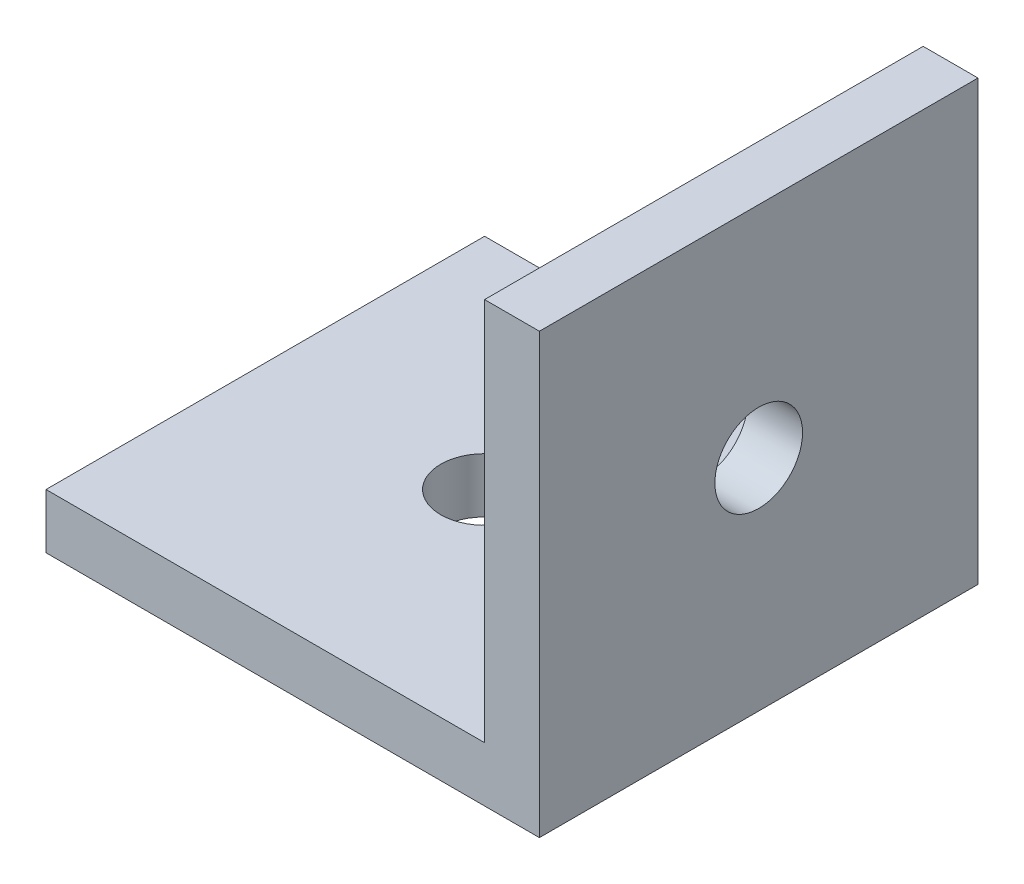
ISO-10303-21;
HEADER;
FILE_DESCRIPTION(('STEP AP214'),'2;1');
FILE_NAME('part.step','',(''),(''),'','','');
FILE_SCHEMA(('AUTOMOTIVE_DESIGN { 1 0 10303 214 1 1 1 1 }'));
ENDSEC;
DATA;
#1=APPLICATION_CONTEXT('core data for automotive mechanical design processes');
#2=APPLICATION_PROTOCOL_DEFINITION('international standard','automotive_design',2000,#1);
#3=PRODUCT_CONTEXT('',#1,'mechanical');
#4=PRODUCT('Part','Part','',(#3));
#5=PRODUCT_RELATED_PRODUCT_CATEGORY('part','',(#4));
#6=PRODUCT_DEFINITION_FORMATION('','',#4);
#7=PRODUCT_DEFINITION_CONTEXT('part definition',#1,'design');
#8=PRODUCT_DEFINITION('design','',#6,#7);
#9=PRODUCT_DEFINITION_SHAPE('','',#8);
#10=(LENGTH_UNIT() NAMED_UNIT(*) SI_UNIT(.MILLI.,.METRE.));
#11=(NAMED_UNIT(*) PLANE_ANGLE_UNIT() SI_UNIT($,.RADIAN.));
#12=(NAMED_UNIT(*) SI_UNIT($,.STERADIAN.) SOLID_ANGLE_UNIT());
#13=UNCERTAINTY_MEASURE_WITH_UNIT(LENGTH_MEASURE(1.E-05),#10,'distance_accuracy_value','');
#14=(GEOMETRIC_REPRESENTATION_CONTEXT(3) GLOBAL_UNCERTAINTY_ASSIGNED_CONTEXT((#13)) GLOBAL_UNIT_ASSIGNED_CONTEXT((#10,
#11,#12)) REPRESENTATION_CONTEXT('',''));
#15=CARTESIAN_POINT('',(0.,0.,0.));
#16=DIRECTION('',(0.,0.,1.));
#17=DIRECTION('',(1.,0.,0.));
#18=AXIS2_PLACEMENT_3D('',#15,#16,#17);
#19=CARTESIAN_POINT('',(0.,5.,0.));
#20=DIRECTION('',(0.,1.,0.));
#21=DIRECTION('',(0.,0.,1.));
#22=AXIS2_PLACEMENT_3D('',#19,#20,#21);
#23=PLANE('',#22);
#24=DIRECTION('',(0.,0.,1.));
#25=VECTOR('',#24,1.);
#26=CARTESIAN_POINT('',(-20.,5.,20.));
#27=LINE('',#26,#25);
#28=CARTESIAN_POINT('',(-20.,5.,-20.));
#29=VERTEX_POINT('',#28);
#30=CARTESIAN_POINT('',(-20.,5.,20.));
#31=VERTEX_POINT('',#30);
#32=EDGE_CURVE('E102',#29,#31,#27,.T.);
#33=ORIENTED_EDGE('',*,*,#32,.T.);
#34=DIRECTION('',(1.,0.,0.));
#35=VECTOR('',#34,1.);
#36=CARTESIAN_POINT('',(20.,5.,20.));
#37=LINE('',#36,#35);
#38=CARTESIAN_POINT('',(20.,5.,20.));
#39=VERTEX_POINT('',#38);
#40=EDGE_CURVE('E96',#31,#39,#37,.T.);
#41=ORIENTED_EDGE('',*,*,#40,.T.);
#42=DIRECTION('',(0.,0.,-1.));
#43=VECTOR('',#42,1.);
#44=CARTESIAN_POINT('',(20.,5.,20.));
#45=LINE('',#44,#43);
#46=CARTESIAN_POINT('',(20.,5.,-20.));
#47=VERTEX_POINT('',#46);
#48=EDGE_CURVE('E85',#39,#47,#45,.T.);
#49=ORIENTED_EDGE('',*,*,#48,.T.);
#50=DIRECTION('',(-1.,0.,0.));
#51=VECTOR('',#50,1.);
#52=CARTESIAN_POINT('',(20.,5.,-20.));
#53=LINE('',#52,#51);
#54=EDGE_CURVE('E65',#47,#29,#53,.T.);
#55=ORIENTED_EDGE('',*,*,#54,.T.);
#56=EDGE_LOOP('',(#33,#41,#49,#55));
#57=FACE_BOUND('',#56,.T.);
#58=CARTESIAN_POINT('',(0.,5.,0.));
#59=DIRECTION('',(0.,1.,0.));
#60=DIRECTION('',(0.,0.,1.));
#61=AXIS2_PLACEMENT_3D('',#58,#59,#60);
#62=CIRCLE('',#61,4.);
#63=CARTESIAN_POINT('',(0.,5.,4.));
#64=VERTEX_POINT('',#63);
#65=EDGE_CURVE('E112',#64,#64,#62,.T.);
#66=ORIENTED_EDGE('',*,*,#65,.F.);
#67=EDGE_LOOP('',(#66));
#68=FACE_BOUND('',#67,.T.);
#69=ADVANCED_FACE('F48',(#57,#68),#23,.T.);
#70=CARTESIAN_POINT('',(0.,0.,0.));
#71=DIRECTION('',(0.,1.,0.));
#72=DIRECTION('',(0.,0.,1.));
#73=AXIS2_PLACEMENT_3D('',#70,#71,#72);
#74=PLANE('',#73);
#75=DIRECTION('',(0.,0.,1.));
#76=VECTOR('',#75,1.);
#77=CARTESIAN_POINT('',(-20.,0.,20.));
#78=LINE('',#77,#76);
#79=CARTESIAN_POINT('',(-20.,0.,-20.));
#80=VERTEX_POINT('',#79);
#81=CARTESIAN_POINT('',(-20.,0.,20.));
#82=VERTEX_POINT('',#81);
#83=EDGE_CURVE('E110',#80,#82,#78,.T.);
#84=ORIENTED_EDGE('',*,*,#83,.F.);
#85=DIRECTION('',(-1.,0.,0.));
#86=VECTOR('',#85,1.);
#87=CARTESIAN_POINT('',(20.,0.,-20.));
#88=LINE('',#87,#86);
#89=CARTESIAN_POINT('',(25.,0.,-20.));
#90=VERTEX_POINT('',#89);
#91=EDGE_CURVE('E108',#90,#80,#88,.T.);
#92=ORIENTED_EDGE('',*,*,#91,.F.);
#93=DIRECTION('',(0.,0.,-1.));
#94=VECTOR('',#93,1.);
#95=CARTESIAN_POINT('',(25.,0.,20.));
#96=LINE('',#95,#94);
#97=CARTESIAN_POINT('',(25.,0.,20.));
#98=VERTEX_POINT('',#97);
#99=EDGE_CURVE('E141',#98,#90,#96,.T.);
#100=ORIENTED_EDGE('',*,*,#99,.F.);
#101=DIRECTION('',(1.,0.,0.));
#102=VECTOR('',#101,1.);
#103=CARTESIAN_POINT('',(20.,0.,20.));
#104=LINE('',#103,#102);
#105=EDGE_CURVE('E78',#82,#98,#104,.T.);
#106=ORIENTED_EDGE('',*,*,#105,.F.);
#107=EDGE_LOOP('',(#84,#92,#100,#106));
#108=FACE_BOUND('',#107,.T.);
#109=CARTESIAN_POINT('',(0.,0.,0.));
#110=DIRECTION('',(0.,1.,0.));
#111=DIRECTION('',(0.,0.,1.));
#112=AXIS2_PLACEMENT_3D('',#109,#110,#111);
#113=CIRCLE('',#112,4.);
#114=CARTESIAN_POINT('',(0.,0.,4.));
#115=VERTEX_POINT('',#114);
#116=EDGE_CURVE('E116',#115,#115,#113,.T.);
#117=ORIENTED_EDGE('',*,*,#116,.T.);
#118=EDGE_LOOP('',(#117));
#119=FACE_BOUND('',#118,.T.);
#120=ADVANCED_FACE('F176',(#108,#119),#74,.F.);
#121=CARTESIAN_POINT('',(-20.,5.,20.));
#122=DIRECTION('',(1.,0.,0.));
#123=DIRECTION('',(0.,0.,-1.));
#124=AXIS2_PLACEMENT_3D('',#121,#122,#123);
#125=PLANE('',#124);
#126=ORIENTED_EDGE('',*,*,#83,.T.);
#127=DIRECTION('',(0.,-1.,0.));
#128=VECTOR('',#127,1.);
#129=CARTESIAN_POINT('',(-20.,5.,20.));
#130=LINE('',#129,#128);
#131=EDGE_CURVE('E12',#31,#82,#130,.T.);
#132=ORIENTED_EDGE('',*,*,#131,.F.);
#133=ORIENTED_EDGE('',*,*,#32,.F.);
#134=DIRECTION('',(0.,-1.,0.));
#135=VECTOR('',#134,1.);
#136=CARTESIAN_POINT('',(-20.,5.,-20.));
#137=LINE('',#136,#135);
#138=EDGE_CURVE('E57',#29,#80,#137,.T.);
#139=ORIENTED_EDGE('',*,*,#138,.T.);
#140=EDGE_LOOP('',(#126,#132,#133,#139));
#141=FACE_BOUND('',#140,.T.);
#142=ADVANCED_FACE('F50',(#141),#125,.F.);
#143=CARTESIAN_POINT('',(20.,5.,20.));
#144=DIRECTION('',(0.,0.,-1.));
#145=DIRECTION('',(-1.,0.,0.));
#146=AXIS2_PLACEMENT_3D('',#143,#144,#145);
#147=PLANE('',#146);
#148=ORIENTED_EDGE('',*,*,#105,.T.);
#149=DIRECTION('',(0.,1.,0.));
#150=VECTOR('',#149,1.);
#151=CARTESIAN_POINT('',(25.,0.,20.));
#152=LINE('',#151,#150);
#153=CARTESIAN_POINT('',(25.,40.,20.));
#154=VERTEX_POINT('',#153);
#155=EDGE_CURVE('E128',#98,#154,#152,.T.);
#156=ORIENTED_EDGE('',*,*,#155,.T.);
#157=DIRECTION('',(-1.,0.,0.));
#158=VECTOR('',#157,1.);
#159=CARTESIAN_POINT('',(25.,40.,20.));
#160=LINE('',#159,#158);
#161=CARTESIAN_POINT('',(20.,40.,20.));
#162=VERTEX_POINT('',#161);
#163=EDGE_CURVE('E123',#154,#162,#160,.T.);
#164=ORIENTED_EDGE('',*,*,#163,.T.);
#165=DIRECTION('',(0.,1.,0.));
#166=VECTOR('',#165,1.);
#167=CARTESIAN_POINT('',(20.,0.,20.));
#168=LINE('',#167,#166);
#169=EDGE_CURVE('E101',#39,#162,#168,.T.);
#170=ORIENTED_EDGE('',*,*,#169,.F.);
#171=ORIENTED_EDGE('',*,*,#40,.F.);
#172=ORIENTED_EDGE('',*,*,#131,.T.);
#173=EDGE_LOOP('',(#148,#156,#164,#170,#171,#172));
#174=FACE_BOUND('',#173,.T.);
#175=ADVANCED_FACE('F97',(#174),#147,.F.);
#176=CARTESIAN_POINT('',(20.,5.,-20.));
#177=DIRECTION('',(0.,0.,1.));
#178=DIRECTION('',(1.,0.,0.));
#179=AXIS2_PLACEMENT_3D('',#176,#177,#178);
#180=PLANE('',#179);
#181=ORIENTED_EDGE('',*,*,#91,.T.);
#182=ORIENTED_EDGE('',*,*,#138,.F.);
#183=ORIENTED_EDGE('',*,*,#54,.F.);
#184=DIRECTION('',(0.,1.,0.));
#185=VECTOR('',#184,1.);
#186=CARTESIAN_POINT('',(20.,0.,-20.));
#187=LINE('',#186,#185);
#188=CARTESIAN_POINT('',(20.,40.,-20.));
#189=VERTEX_POINT('',#188);
#190=EDGE_CURVE('E132',#47,#189,#187,.T.);
#191=ORIENTED_EDGE('',*,*,#190,.T.);
#192=DIRECTION('',(-1.,0.,0.));
#193=VECTOR('',#192,1.);
#194=CARTESIAN_POINT('',(25.,40.,-20.));
#195=LINE('',#194,#193);
#196=CARTESIAN_POINT('',(25.,40.,-20.));
#197=VERTEX_POINT('',#196);
#198=EDGE_CURVE('E125',#197,#189,#195,.T.);
#199=ORIENTED_EDGE('',*,*,#198,.F.);
#200=DIRECTION('',(0.,1.,0.));
#201=VECTOR('',#200,1.);
#202=CARTESIAN_POINT('',(25.,0.,-20.));
#203=LINE('',#202,#201);
#204=EDGE_CURVE('E144',#90,#197,#203,.T.);
#205=ORIENTED_EDGE('',*,*,#204,.F.);
#206=EDGE_LOOP('',(#181,#182,#183,#191,#199,#205));
#207=FACE_BOUND('',#206,.T.);
#208=ADVANCED_FACE('F170',(#207),#180,.F.);
#209=CARTESIAN_POINT('',(0.,5.,0.));
#210=DIRECTION('',(0.,-1.,0.));
#211=DIRECTION('',(0.,0.,-1.));
#212=AXIS2_PLACEMENT_3D('',#209,#210,#211);
#213=CYLINDRICAL_SURFACE('',#212,4.);
#214=ORIENTED_EDGE('',*,*,#65,.T.);
#215=EDGE_LOOP('',(#214));
#216=FACE_BOUND('',#215,.T.);
#217=ORIENTED_EDGE('',*,*,#116,.F.);
#218=EDGE_LOOP('',(#217));
#219=FACE_BOUND('',#218,.T.);
#220=ADVANCED_FACE('F161',(#216,#219),#213,.F.);
#221=CARTESIAN_POINT('',(25.,0.,0.));
#222=DIRECTION('',(1.,0.,0.));
#223=DIRECTION('',(0.,0.,-1.));
#224=AXIS2_PLACEMENT_3D('',#221,#222,#223);
#225=PLANE('',#224);
#226=DIRECTION('',(0.,0.,-1.));
#227=VECTOR('',#226,1.);
#228=CARTESIAN_POINT('',(25.,40.,20.));
#229=LINE('',#228,#227);
#230=EDGE_CURVE('E131',#154,#197,#229,.T.);
#231=ORIENTED_EDGE('',*,*,#230,.F.);
#232=ORIENTED_EDGE('',*,*,#155,.F.);
#233=ORIENTED_EDGE('',*,*,#99,.T.);
#234=ORIENTED_EDGE('',*,*,#204,.T.);
#235=EDGE_LOOP('',(#231,#232,#233,#234));
#236=FACE_BOUND('',#235,.T.);
#237=CARTESIAN_POINT('',(25.,20.,0.));
#238=DIRECTION('',(1.,0.,0.));
#239=DIRECTION('',(0.,0.,-1.));
#240=AXIS2_PLACEMENT_3D('',#237,#238,#239);
#241=CIRCLE('',#240,4.);
#242=CARTESIAN_POINT('',(25.,20.,-4.));
#243=VERTEX_POINT('',#242);
#244=EDGE_CURVE('E138',#243,#243,#241,.T.);
#245=ORIENTED_EDGE('',*,*,#244,.F.);
#246=EDGE_LOOP('',(#245));
#247=FACE_BOUND('',#246,.T.);
#248=ADVANCED_FACE('F158',(#236,#247),#225,.T.);
#249=CARTESIAN_POINT('',(20.,0.,0.));
#250=DIRECTION('',(1.,0.,0.));
#251=DIRECTION('',(0.,0.,-1.));
#252=AXIS2_PLACEMENT_3D('',#249,#250,#251);
#253=PLANE('',#252);
#254=ORIENTED_EDGE('',*,*,#48,.F.);
#255=ORIENTED_EDGE('',*,*,#169,.T.);
#256=DIRECTION('',(0.,0.,-1.));
#257=VECTOR('',#256,1.);
#258=CARTESIAN_POINT('',(20.,40.,20.));
#259=LINE('',#258,#257);
#260=EDGE_CURVE('E135',#162,#189,#259,.T.);
#261=ORIENTED_EDGE('',*,*,#260,.T.);
#262=ORIENTED_EDGE('',*,*,#190,.F.);
#263=EDGE_LOOP('',(#254,#255,#261,#262));
#264=FACE_BOUND('',#263,.T.);
#265=CARTESIAN_POINT('',(20.,20.,0.));
#266=DIRECTION('',(1.,0.,0.));
#267=DIRECTION('',(0.,0.,-1.));
#268=AXIS2_PLACEMENT_3D('',#265,#266,#267);
#269=CIRCLE('',#268,4.);
#270=CARTESIAN_POINT('',(20.,20.,-4.));
#271=VERTEX_POINT('',#270);
#272=EDGE_CURVE('E149',#271,#271,#269,.T.);
#273=ORIENTED_EDGE('',*,*,#272,.T.);
#274=EDGE_LOOP('',(#273));
#275=FACE_BOUND('',#274,.T.);
#276=ADVANCED_FACE('F160',(#264,#275),#253,.F.);
#277=CARTESIAN_POINT('',(25.,40.,20.));
#278=DIRECTION('',(0.,1.,0.));
#279=DIRECTION('',(0.,0.,1.));
#280=AXIS2_PLACEMENT_3D('',#277,#278,#279);
#281=PLANE('',#280);
#282=ORIENTED_EDGE('',*,*,#260,.F.);
#283=ORIENTED_EDGE('',*,*,#163,.F.);
#284=ORIENTED_EDGE('',*,*,#230,.T.);
#285=ORIENTED_EDGE('',*,*,#198,.T.);
#286=EDGE_LOOP('',(#282,#283,#284,#285));
#287=FACE_BOUND('',#286,.T.);
#288=ADVANCED_FACE('F168',(#287),#281,.T.);
#289=CARTESIAN_POINT('',(25.,20.,0.));
#290=DIRECTION('',(-1.,0.,0.));
#291=DIRECTION('',(0.,0.,1.));
#292=AXIS2_PLACEMENT_3D('',#289,#290,#291);
#293=CYLINDRICAL_SURFACE('',#292,4.);
#294=ORIENTED_EDGE('',*,*,#244,.T.);
#295=EDGE_LOOP('',(#294));
#296=FACE_BOUND('',#295,.T.);
#297=ORIENTED_EDGE('',*,*,#272,.F.);
#298=EDGE_LOOP('',(#297));
#299=FACE_BOUND('',#298,.T.);
#300=ADVANCED_FACE('F155',(#296,#299),#293,.F.);
#301=CLOSED_SHELL('',(#69,#120,#142,#175,#208,#220,#248,#276,#288,#300));
#302=MANIFOLD_SOLID_BREP('B2',#301);
#303=ADVANCED_BREP_SHAPE_REPRESENTATION('',(#18,#302),#14);
#304=SHAPE_DEFINITION_REPRESENTATION(#9,#303);
ENDSEC;
END-ISO-10303-21;
